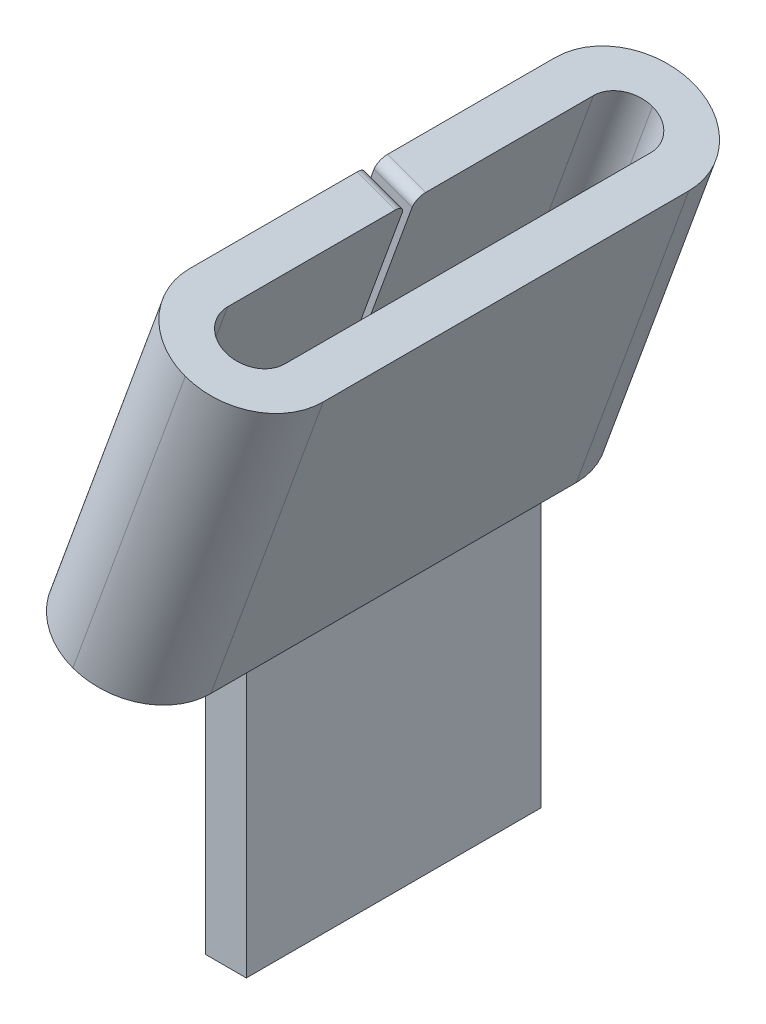
ISO-10303-21;
HEADER;
FILE_DESCRIPTION(('STEP AP214'),'2;1');
FILE_NAME('part.step','',(''),(''),'','','');
FILE_SCHEMA(('AUTOMOTIVE_DESIGN { 1 0 10303 214 1 1 1 1 }'));
ENDSEC;
DATA;
#1=APPLICATION_CONTEXT('core data for automotive mechanical design processes');
#2=APPLICATION_PROTOCOL_DEFINITION('international standard','automotive_design',2000,#1);
#3=PRODUCT_CONTEXT('',#1,'mechanical');
#4=PRODUCT('Part','Part','',(#3));
#5=PRODUCT_RELATED_PRODUCT_CATEGORY('part','',(#4));
#6=PRODUCT_DEFINITION_FORMATION('','',#4);
#7=PRODUCT_DEFINITION_CONTEXT('part definition',#1,'design');
#8=PRODUCT_DEFINITION('design','',#6,#7);
#9=PRODUCT_DEFINITION_SHAPE('','',#8);
#10=(LENGTH_UNIT() NAMED_UNIT(*) SI_UNIT(.MILLI.,.METRE.));
#11=(NAMED_UNIT(*) PLANE_ANGLE_UNIT() SI_UNIT($,.RADIAN.));
#12=(NAMED_UNIT(*) SI_UNIT($,.STERADIAN.) SOLID_ANGLE_UNIT());
#13=UNCERTAINTY_MEASURE_WITH_UNIT(LENGTH_MEASURE(1.E-05),#10,'distance_accuracy_value','');
#14=(GEOMETRIC_REPRESENTATION_CONTEXT(3) GLOBAL_UNCERTAINTY_ASSIGNED_CONTEXT((#13)) GLOBAL_UNIT_ASSIGNED_CONTEXT((#10,
#11,#12)) REPRESENTATION_CONTEXT('',''));
#15=CARTESIAN_POINT('',(0.,0.,0.));
#16=DIRECTION('',(0.,0.,1.));
#17=DIRECTION('',(1.,0.,0.));
#18=AXIS2_PLACEMENT_3D('',#15,#16,#17);
#19=CARTESIAN_POINT('',(18.9404173832291,24.3126452780733,53.877124258992));
#20=DIRECTION('',(-0.939692620785908,0.342020143325669,0.));
#21=DIRECTION('',(0.342020143325669,0.939692620785908,0.));
#22=AXIS2_PLACEMENT_3D('',#19,#20,#21);
#23=CYLINDRICAL_SURFACE('',#22,0.5);
#24=CARTESIAN_POINT('',(16.1213395208714,25.3387057080503,53.877124258992));
#25=DIRECTION('',(0.939692620785908,-0.342020143325669,0.));
#26=DIRECTION('',(-0.342020143325669,-0.939692620785908,0.));
#27=AXIS2_PLACEMENT_3D('',#24,#25,#26);
#28=CIRCLE('',#27,0.5);
#29=CARTESIAN_POINT('',(16.1213395208714,25.3387057080503,54.377124258992));
#30=VERTEX_POINT('',#29);
#31=CARTESIAN_POINT('',(15.9503294492085,24.8688593976573,53.877124258992));
#32=VERTEX_POINT('',#31);
#33=EDGE_CURVE('E282',#30,#32,#28,.T.);
#34=ORIENTED_EDGE('',*,*,#33,.F.);
#35=DIRECTION('',(0.939692620785909,-0.342020143325666,0.));
#36=VECTOR('',#35,1.);
#37=CARTESIAN_POINT('',(17.2959552968538,24.9111805288932,54.377124258992));
#38=LINE('',#37,#36);
#39=CARTESIAN_POINT('',(14.2419542792995,26.0227459947016,54.377124258992));
#40=VERTEX_POINT('',#39);
#41=EDGE_CURVE('E36',#40,#30,#38,.T.);
#42=ORIENTED_EDGE('',*,*,#41,.F.);
#43=CARTESIAN_POINT('',(14.2419542792995,26.0227459947016,53.877124258992));
#44=DIRECTION('',(-0.939692620785909,0.342020143325666,0.));
#45=DIRECTION('',(-0.342020143325666,-0.939692620785909,0.));
#46=AXIS2_PLACEMENT_3D('',#43,#44,#45);
#47=CIRCLE('',#46,0.5);
#48=CARTESIAN_POINT('',(14.0709442076367,25.5528996843087,53.877124258992));
#49=VERTEX_POINT('',#48);
#50=EDGE_CURVE('E377',#49,#40,#47,.T.);
#51=ORIENTED_EDGE('',*,*,#50,.F.);
#52=DIRECTION('',(-0.939692620785909,0.342020143325666,0.));
#53=VECTOR('',#52,1.);
#54=CARTESIAN_POINT('',(18.7694073115662,23.8427989676803,53.877124258992));
#55=LINE('',#54,#53);
#56=EDGE_CURVE('E262',#32,#49,#55,.T.);
#57=ORIENTED_EDGE('',*,*,#56,.F.);
#58=EDGE_LOOP('',(#34,#42,#51,#57));
#59=FACE_BOUND('',#58,.T.);
#60=ADVANCED_FACE('F16',(#59),#23,.T.);
#61=CARTESIAN_POINT('',(18.9404173832291,24.3126452780733,55.377124258992));
#62=DIRECTION('',(0.939692620785908,-0.342020143325669,0.));
#63=DIRECTION('',(-0.342020143325669,-0.939692620785908,0.));
#64=AXIS2_PLACEMENT_3D('',#61,#62,#63);
#65=CYLINDRICAL_SURFACE('',#64,0.5);
#66=CARTESIAN_POINT('',(14.2419542792995,26.0227459947016,55.377124258992));
#67=DIRECTION('',(-0.939692620785909,0.342020143325666,0.));
#68=DIRECTION('',(-0.342020143325666,-0.939692620785909,0.));
#69=AXIS2_PLACEMENT_3D('',#66,#67,#68);
#70=CIRCLE('',#69,0.5);
#71=CARTESIAN_POINT('',(14.2419542792995,26.0227459947016,54.877124258992));
#72=VERTEX_POINT('',#71);
#73=CARTESIAN_POINT('',(14.0709442076367,25.5528996843087,55.377124258992));
#74=VERTEX_POINT('',#73);
#75=EDGE_CURVE('E614',#72,#74,#70,.T.);
#76=ORIENTED_EDGE('',*,*,#75,.F.);
#77=DIRECTION('',(-0.939692620785909,0.342020143325666,0.));
#78=VECTOR('',#77,1.);
#79=CARTESIAN_POINT('',(17.2959552968538,24.9111805288932,54.877124258992));
#80=LINE('',#79,#78);
#81=CARTESIAN_POINT('',(16.1213395208714,25.3387057080503,54.877124258992));
#82=VERTEX_POINT('',#81);
#83=EDGE_CURVE('E11',#82,#72,#80,.T.);
#84=ORIENTED_EDGE('',*,*,#83,.F.);
#85=CARTESIAN_POINT('',(16.1213395208714,25.3387057080503,55.377124258992));
#86=DIRECTION('',(0.939692620785908,-0.342020143325669,0.));
#87=DIRECTION('',(-0.342020143325669,-0.939692620785908,0.));
#88=AXIS2_PLACEMENT_3D('',#85,#86,#87);
#89=CIRCLE('',#88,0.5);
#90=CARTESIAN_POINT('',(15.9503294492085,24.8688593976573,55.377124258992));
#91=VERTEX_POINT('',#90);
#92=EDGE_CURVE('E508',#91,#82,#89,.T.);
#93=ORIENTED_EDGE('',*,*,#92,.F.);
#94=DIRECTION('',(0.939692620785909,-0.342020143325666,0.));
#95=VECTOR('',#94,1.);
#96=CARTESIAN_POINT('',(18.7694073115662,23.8427989676803,55.377124258992));
#97=LINE('',#96,#95);
#98=EDGE_CURVE('E466',#74,#91,#97,.T.);
#99=ORIENTED_EDGE('',*,*,#98,.F.);
#100=EDGE_LOOP('',(#76,#84,#93,#99));
#101=FACE_BOUND('',#100,.T.);
#102=ADVANCED_FACE('F566',(#101),#65,.T.);
#103=CARTESIAN_POINT('',(22.4862827143743,39.1714879081073,55.377124258992));
#104=DIRECTION('',(-0.939692620785909,0.342020143325667,0.));
#105=DIRECTION('',(0.342020143325667,0.939692620785909,0.));
#106=AXIS2_PLACEMENT_3D('',#103,#104,#105);
#107=CYLINDRICAL_SURFACE('',#106,0.5);
#108=CARTESIAN_POINT('',(19.4322816968201,40.2830533739157,55.377124258992));
#109=DIRECTION('',(-0.939692620785909,0.342020143325667,0.));
#110=DIRECTION('',(-0.342020143325667,-0.939692620785909,0.));
#111=AXIS2_PLACEMENT_3D('',#108,#109,#110);
#112=CIRCLE('',#111,0.5);
#113=CARTESIAN_POINT('',(19.6032917684829,40.7528996843086,55.377124258992));
#114=VERTEX_POINT('',#113);
#115=CARTESIAN_POINT('',(19.4322816968201,40.2830533739157,54.877124258992));
#116=VERTEX_POINT('',#115);
#117=EDGE_CURVE('E617',#114,#116,#112,.T.);
#118=ORIENTED_EDGE('',*,*,#117,.F.);
#119=DIRECTION('',(-0.939692620785909,0.342020143325666,0.));
#120=VECTOR('',#119,1.);
#121=CARTESIAN_POINT('',(19.6032917684829,40.7528996843086,55.377124258992));
#122=LINE('',#121,#120);
#123=CARTESIAN_POINT('',(21.4826770100548,40.0688593976573,55.377124258992));
#124=VERTEX_POINT('',#123);
#125=EDGE_CURVE('E353',#124,#114,#122,.T.);
#126=ORIENTED_EDGE('',*,*,#125,.F.);
#127=CARTESIAN_POINT('',(21.3116669383919,39.5990130872643,55.377124258992));
#128=DIRECTION('',(0.939692620785909,-0.342020143325667,0.));
#129=DIRECTION('',(-0.342020143325667,-0.939692620785909,0.));
#130=AXIS2_PLACEMENT_3D('',#127,#128,#129);
#131=CIRCLE('',#130,0.5);
#132=CARTESIAN_POINT('',(21.3116669383919,39.5990130872644,54.877124258992));
#133=VERTEX_POINT('',#132);
#134=EDGE_CURVE('E497',#133,#124,#131,.T.);
#135=ORIENTED_EDGE('',*,*,#134,.F.);
#136=DIRECTION('',(0.939692620785909,-0.342020143325666,0.));
#137=VECTOR('',#136,1.);
#138=CARTESIAN_POINT('',(21.3116669383919,39.5990130872643,54.877124258992));
#139=LINE('',#138,#137);
#140=EDGE_CURVE('E19',#116,#133,#139,.T.);
#141=ORIENTED_EDGE('',*,*,#140,.F.);
#142=EDGE_LOOP('',(#118,#126,#135,#141));
#143=FACE_BOUND('',#142,.T.);
#144=ADVANCED_FACE('F570',(#143),#107,.T.);
#145=CARTESIAN_POINT('',(22.4862827143743,39.1714879081073,53.877124258992));
#146=DIRECTION('',(0.939692620785909,-0.342020143325667,0.));
#147=DIRECTION('',(-0.342020143325667,-0.939692620785909,0.));
#148=AXIS2_PLACEMENT_3D('',#145,#146,#147);
#149=CYLINDRICAL_SURFACE('',#148,0.5);
#150=CARTESIAN_POINT('',(21.3116669383919,39.5990130872643,53.877124258992));
#151=DIRECTION('',(0.939692620785909,-0.342020143325667,0.));
#152=DIRECTION('',(-0.342020143325667,-0.939692620785909,0.));
#153=AXIS2_PLACEMENT_3D('',#150,#151,#152);
#154=CIRCLE('',#153,0.5);
#155=CARTESIAN_POINT('',(21.4826770100548,40.0688593976573,53.877124258992));
#156=VERTEX_POINT('',#155);
#157=CARTESIAN_POINT('',(21.3116669383919,39.5990130872644,54.377124258992));
#158=VERTEX_POINT('',#157);
#159=EDGE_CURVE('E277',#156,#158,#154,.T.);
#160=ORIENTED_EDGE('',*,*,#159,.F.);
#161=DIRECTION('',(0.939692620785909,-0.342020143325666,0.));
#162=VECTOR('',#161,1.);
#163=CARTESIAN_POINT('',(21.4826770100547,40.0688593976573,53.877124258992));
#164=LINE('',#163,#162);
#165=CARTESIAN_POINT('',(19.6032917684829,40.7528996843086,53.877124258992));
#166=VERTEX_POINT('',#165);
#167=EDGE_CURVE('E329',#166,#156,#164,.T.);
#168=ORIENTED_EDGE('',*,*,#167,.F.);
#169=CARTESIAN_POINT('',(19.4322816968201,40.2830533739157,53.877124258992));
#170=DIRECTION('',(-0.939692620785909,0.342020143325667,0.));
#171=DIRECTION('',(-0.342020143325667,-0.939692620785909,0.));
#172=AXIS2_PLACEMENT_3D('',#169,#170,#171);
#173=CIRCLE('',#172,0.5);
#174=CARTESIAN_POINT('',(19.4322816968201,40.2830533739157,54.377124258992));
#175=VERTEX_POINT('',#174);
#176=EDGE_CURVE('E371',#175,#166,#173,.T.);
#177=ORIENTED_EDGE('',*,*,#176,.F.);
#178=DIRECTION('',(-0.939692620785909,0.342020143325666,0.));
#179=VECTOR('',#178,1.);
#180=CARTESIAN_POINT('',(19.4322816968201,40.2830533739157,54.377124258992));
#181=LINE('',#180,#179);
#182=EDGE_CURVE('E49',#158,#175,#181,.T.);
#183=ORIENTED_EDGE('',*,*,#182,.F.);
#184=EDGE_LOOP('',(#160,#168,#177,#183));
#185=FACE_BOUND('',#184,.T.);
#186=ADVANCED_FACE('F575',(#185),#149,.T.);
#187=CARTESIAN_POINT('',(10.5169970674895,6.28614586628859,54.877124258992));
#188=DIRECTION('',(0.,0.,1.));
#189=DIRECTION('',(0.,-1.,0.));
#190=AXIS2_PLACEMENT_3D('',#187,#188,#189);
#191=PLANE('',#190);
#192=DIRECTION('',(0.342020143325666,0.939692620785909,0.));
#193=VECTOR('',#192,1.);
#194=CARTESIAN_POINT('',(7.46299604993528,7.39771133209699,54.877124258992));
#195=LINE('',#194,#193);
#196=EDGE_CURVE('E619',#72,#116,#195,.T.);
#197=ORIENTED_EDGE('',*,*,#196,.T.);
#198=ORIENTED_EDGE('',*,*,#140,.T.);
#199=DIRECTION('',(0.342020143325666,0.939692620785909,0.));
#200=VECTOR('',#199,1.);
#201=CARTESIAN_POINT('',(12.1626281044303,14.4622354812413,54.877124258992));
#202=LINE('',#201,#200);
#203=EDGE_CURVE('E493',#82,#133,#202,.T.);
#204=ORIENTED_EDGE('',*,*,#203,.F.);
#205=ORIENTED_EDGE('',*,*,#83,.T.);
#206=EDGE_LOOP('',(#197,#198,#204,#205));
#207=FACE_BOUND('',#206,.T.);
#208=ADVANCED_FACE('F580',(#207),#191,.F.);
#209=CARTESIAN_POINT('',(10.5169970674895,6.28614586628859,54.377124258992));
#210=DIRECTION('',(0.,0.,-1.));
#211=DIRECTION('',(0.,-1.,0.));
#212=AXIS2_PLACEMENT_3D('',#209,#210,#211);
#213=PLANE('',#212);
#214=DIRECTION('',(-0.342020143325666,-0.939692620785909,0.));
#215=VECTOR('',#214,1.);
#216=CARTESIAN_POINT('',(12.1626281044303,14.4622354812413,54.377124258992));
#217=LINE('',#216,#215);
#218=EDGE_CURVE('E281',#158,#30,#217,.T.);
#219=ORIENTED_EDGE('',*,*,#218,.F.);
#220=ORIENTED_EDGE('',*,*,#182,.T.);
#221=DIRECTION('',(-0.342020143325666,-0.939692620785909,0.));
#222=VECTOR('',#221,1.);
#223=CARTESIAN_POINT('',(7.46299604993528,7.39771133209699,54.377124258992));
#224=LINE('',#223,#222);
#225=EDGE_CURVE('E368',#175,#40,#224,.T.);
#226=ORIENTED_EDGE('',*,*,#225,.T.);
#227=ORIENTED_EDGE('',*,*,#41,.T.);
#228=EDGE_LOOP('',(#219,#220,#226,#227));
#229=FACE_BOUND('',#228,.T.);
#230=ADVANCED_FACE('F583',(#229),#213,.F.);
#231=CARTESIAN_POINT('',(17.3598683803874,24.3558291826688,45.627124258992));
#232=DIRECTION('',(-0.342020143325665,-0.93969262078591,0.));
#233=DIRECTION('',(-0.93969262078591,0.342020143325665,0.));
#234=AXIS2_PLACEMENT_3D('',#231,#232,#233);
#235=CYLINDRICAL_SURFACE('',#234,3.5);
#236=CARTESIAN_POINT('',(17.3598683803874,24.3558291826688,45.627124258992));
#237=DIRECTION('',(-0.342020143325666,-0.939692620785909,0.));
#238=DIRECTION('',(-0.939692620785909,0.342020143325666,0.));
#239=AXIS2_PLACEMENT_3D('',#236,#237,#238);
#240=CIRCLE('',#239,3.5);
#241=CARTESIAN_POINT('',(17.3598683803874,24.3558291826688,42.1271242589921));
#242=VERTEX_POINT('',#241);
#243=CARTESIAN_POINT('',(20.6487925531381,23.158758681029,45.627124258992));
#244=VERTEX_POINT('',#243);
#245=EDGE_CURVE('E246',#242,#244,#240,.T.);
#246=ORIENTED_EDGE('',*,*,#245,.F.);
#247=DIRECTION('',(0.342020143325666,0.939692620785909,0.));
#248=VECTOR('',#247,1.);
#249=CARTESIAN_POINT('',(17.3598683803874,24.3558291826688,42.1271242589921));
#250=LINE('',#249,#248);
#251=CARTESIAN_POINT('',(22.8922159412336,39.5558291826688,42.1271242589921));
#252=VERTEX_POINT('',#251);
#253=EDGE_CURVE('E233',#242,#252,#250,.T.);
#254=ORIENTED_EDGE('',*,*,#253,.T.);
#255=CARTESIAN_POINT('',(22.8922159412336,39.5558291826688,45.627124258992));
#256=DIRECTION('',(0.342020143325667,0.939692620785909,0.));
#257=DIRECTION('',(-0.939692620785909,0.342020143325667,0.));
#258=AXIS2_PLACEMENT_3D('',#255,#256,#257);
#259=CIRCLE('',#258,3.5);
#260=CARTESIAN_POINT('',(26.1811401139843,38.358758681029,45.627124258992));
#261=VERTEX_POINT('',#260);
#262=EDGE_CURVE('E363',#261,#252,#259,.T.);
#263=ORIENTED_EDGE('',*,*,#262,.F.);
#264=DIRECTION('',(0.342020143325665,0.93969262078591,0.));
#265=VECTOR('',#264,1.);
#266=CARTESIAN_POINT('',(26.1811401139843,38.358758681029,45.627124258992));
#267=LINE('',#266,#265);
#268=EDGE_CURVE('E249',#244,#261,#267,.T.);
#269=ORIENTED_EDGE('',*,*,#268,.F.);
#270=EDGE_LOOP('',(#246,#254,#263,#269));
#271=FACE_BOUND('',#270,.T.);
#272=ADVANCED_FACE('F247',(#271),#235,.T.);
#273=CARTESIAN_POINT('',(17.3598683803874,24.3558291826688,45.627124258992));
#274=DIRECTION('',(0.342020143325666,0.939692620785909,0.));
#275=DIRECTION('',(0.939692620785909,-0.342020143325666,0.));
#276=AXIS2_PLACEMENT_3D('',#273,#274,#275);
#277=CYLINDRICAL_SURFACE('',#276,3.5);
#278=ORIENTED_EDGE('',*,*,#253,.F.);
#279=CARTESIAN_POINT('',(17.3598683803874,24.3558291826688,45.627124258992));
#280=DIRECTION('',(-0.342020143325666,-0.939692620785909,0.));
#281=DIRECTION('',(-0.939692620785909,0.342020143325666,0.));
#282=AXIS2_PLACEMENT_3D('',#279,#280,#281);
#283=CIRCLE('',#282,3.5);
#284=CARTESIAN_POINT('',(14.0709442076367,25.5528996843087,45.627124258992));
#285=VERTEX_POINT('',#284);
#286=EDGE_CURVE('E237',#285,#242,#283,.T.);
#287=ORIENTED_EDGE('',*,*,#286,.F.);
#288=DIRECTION('',(-0.342020143325666,-0.939692620785909,0.));
#289=VECTOR('',#288,1.);
#290=CARTESIAN_POINT('',(14.0709442076367,25.5528996843087,45.627124258992));
#291=LINE('',#290,#289);
#292=CARTESIAN_POINT('',(19.6032917684829,40.7528996843086,45.627124258992));
#293=VERTEX_POINT('',#292);
#294=EDGE_CURVE('E374',#293,#285,#291,.T.);
#295=ORIENTED_EDGE('',*,*,#294,.F.);
#296=CARTESIAN_POINT('',(22.8922159412336,39.5558291826688,45.627124258992));
#297=DIRECTION('',(0.342020143325667,0.939692620785909,0.));
#298=DIRECTION('',(-0.939692620785909,0.342020143325667,0.));
#299=AXIS2_PLACEMENT_3D('',#296,#297,#298);
#300=CIRCLE('',#299,3.5);
#301=EDGE_CURVE('E240',#252,#293,#300,.T.);
#302=ORIENTED_EDGE('',*,*,#301,.F.);
#303=EDGE_LOOP('',(#278,#287,#295,#302));
#304=FACE_BOUND('',#303,.T.);
#305=ADVANCED_FACE('F235',(#304),#277,.T.);
#306=CARTESIAN_POINT('',(17.3598683803874,24.3558291826688,63.627124258992));
#307=DIRECTION('',(-0.342020143325666,-0.939692620785909,0.));
#308=DIRECTION('',(-0.939692620785909,0.342020143325666,0.));
#309=AXIS2_PLACEMENT_3D('',#306,#307,#308);
#310=CYLINDRICAL_SURFACE('',#309,3.5);
#311=CARTESIAN_POINT('',(17.3598683803874,24.3558291826688,63.627124258992));
#312=DIRECTION('',(-0.342020143325666,-0.939692620785909,0.));
#313=DIRECTION('',(-0.939692620785909,0.342020143325666,0.));
#314=AXIS2_PLACEMENT_3D('',#311,#312,#313);
#315=CIRCLE('',#314,3.5);
#316=CARTESIAN_POINT('',(17.3598683803874,24.3558291826688,67.127124258992));
#317=VERTEX_POINT('',#316);
#318=CARTESIAN_POINT('',(14.0709442076367,25.5528996843087,63.627124258992));
#319=VERTEX_POINT('',#318);
#320=EDGE_CURVE('E459',#317,#319,#315,.T.);
#321=ORIENTED_EDGE('',*,*,#320,.F.);
#322=DIRECTION('',(0.342020143325665,0.93969262078591,0.));
#323=VECTOR('',#322,1.);
#324=CARTESIAN_POINT('',(17.3598683803874,24.3558291826688,67.127124258992));
#325=LINE('',#324,#323);
#326=CARTESIAN_POINT('',(22.8922159412336,39.5558291826688,67.127124258992));
#327=VERTEX_POINT('',#326);
#328=EDGE_CURVE('E244',#317,#327,#325,.T.);
#329=ORIENTED_EDGE('',*,*,#328,.T.);
#330=CARTESIAN_POINT('',(22.8922159412336,39.5558291826688,63.627124258992));
#331=DIRECTION('',(0.342020143325667,0.939692620785909,0.));
#332=DIRECTION('',(-0.939692620785909,0.342020143325667,0.));
#333=AXIS2_PLACEMENT_3D('',#330,#331,#332);
#334=CIRCLE('',#333,3.5);
#335=CARTESIAN_POINT('',(19.6032917684829,40.7528996843086,63.627124258992));
#336=VERTEX_POINT('',#335);
#337=EDGE_CURVE('E356',#336,#327,#334,.T.);
#338=ORIENTED_EDGE('',*,*,#337,.F.);
#339=DIRECTION('',(0.342020143325666,0.939692620785909,0.));
#340=VECTOR('',#339,1.);
#341=CARTESIAN_POINT('',(19.6032917684829,40.7528996843086,63.627124258992));
#342=LINE('',#341,#340);
#343=EDGE_CURVE('E471',#319,#336,#342,.T.);
#344=ORIENTED_EDGE('',*,*,#343,.F.);
#345=EDGE_LOOP('',(#321,#329,#338,#344));
#346=FACE_BOUND('',#345,.T.);
#347=ADVANCED_FACE('F562',(#346),#310,.T.);
#348=CARTESIAN_POINT('',(17.3598683803874,24.3558291826688,63.627124258992));
#349=DIRECTION('',(0.342020143325665,0.93969262078591,0.));
#350=DIRECTION('',(0.93969262078591,-0.342020143325665,0.));
#351=AXIS2_PLACEMENT_3D('',#348,#349,#350);
#352=CYLINDRICAL_SURFACE('',#351,3.5);
#353=ORIENTED_EDGE('',*,*,#328,.F.);
#354=CARTESIAN_POINT('',(17.3598683803874,24.3558291826688,63.627124258992));
#355=DIRECTION('',(-0.342020143325666,-0.939692620785909,0.));
#356=DIRECTION('',(-0.939692620785909,0.342020143325666,0.));
#357=AXIS2_PLACEMENT_3D('',#354,#355,#356);
#358=CIRCLE('',#357,3.5);
#359=CARTESIAN_POINT('',(20.6487925531381,23.158758681029,63.627124258992));
#360=VERTEX_POINT('',#359);
#361=EDGE_CURVE('E483',#360,#317,#358,.T.);
#362=ORIENTED_EDGE('',*,*,#361,.F.);
#363=DIRECTION('',(-0.342020143325665,-0.93969262078591,0.));
#364=VECTOR('',#363,1.);
#365=CARTESIAN_POINT('',(20.6487925531381,23.158758681029,63.627124258992));
#366=LINE('',#365,#364);
#367=CARTESIAN_POINT('',(26.1811401139843,38.358758681029,63.627124258992));
#368=VERTEX_POINT('',#367);
#369=EDGE_CURVE('E317',#368,#360,#366,.T.);
#370=ORIENTED_EDGE('',*,*,#369,.F.);
#371=CARTESIAN_POINT('',(22.8922159412336,39.5558291826688,63.627124258992));
#372=DIRECTION('',(0.342020143325667,0.939692620785909,0.));
#373=DIRECTION('',(-0.939692620785909,0.342020143325667,0.));
#374=AXIS2_PLACEMENT_3D('',#371,#372,#373);
#375=CIRCLE('',#374,3.5);
#376=EDGE_CURVE('E360',#327,#368,#375,.T.);
#377=ORIENTED_EDGE('',*,*,#376,.F.);
#378=EDGE_LOOP('',(#353,#362,#370,#377));
#379=FACE_BOUND('',#378,.T.);
#380=ADVANCED_FACE('F554',(#379),#352,.T.);
#381=CARTESIAN_POINT('',(13.5721670356092,13.9492052662528,45.627124258992));
#382=DIRECTION('',(-0.342020143325667,-0.939692620785909,0.));
#383=DIRECTION('',(-0.939692620785909,0.342020143325667,0.));
#384=AXIS2_PLACEMENT_3D('',#381,#382,#383);
#385=CYLINDRICAL_SURFACE('',#384,1.5);
#386=CARTESIAN_POINT('',(17.3598683803874,24.3558291826688,45.627124258992));
#387=DIRECTION('',(0.342020143325666,0.939692620785909,0.));
#388=DIRECTION('',(-0.939692620785909,0.342020143325666,0.));
#389=AXIS2_PLACEMENT_3D('',#386,#387,#388);
#390=CIRCLE('',#389,1.5);
#391=CARTESIAN_POINT('',(17.3598683803874,24.3558291826688,44.127124258992));
#392=VERTEX_POINT('',#391);
#393=CARTESIAN_POINT('',(15.9503294492085,24.8688593976573,45.627124258992));
#394=VERTEX_POINT('',#393);
#395=EDGE_CURVE('E276',#392,#394,#390,.T.);
#396=ORIENTED_EDGE('',*,*,#395,.F.);
#397=DIRECTION('',(0.342020143325668,0.939692620785909,0.));
#398=VECTOR('',#397,1.);
#399=CARTESIAN_POINT('',(22.8922159412336,39.5558291826688,44.127124258992));
#400=LINE('',#399,#398);
#401=CARTESIAN_POINT('',(22.8922159412336,39.5558291826688,44.127124258992));
#402=VERTEX_POINT('',#401);
#403=EDGE_CURVE('E291',#392,#402,#400,.T.);
#404=ORIENTED_EDGE('',*,*,#403,.T.);
#405=CARTESIAN_POINT('',(22.8922159412336,39.5558291826688,45.627124258992));
#406=DIRECTION('',(-0.342020143325664,-0.93969262078591,0.));
#407=DIRECTION('',(-0.93969262078591,0.342020143325664,0.));
#408=AXIS2_PLACEMENT_3D('',#405,#406,#407);
#409=CIRCLE('',#408,1.5);
#410=CARTESIAN_POINT('',(21.4826770100548,40.0688593976573,45.627124258992));
#411=VERTEX_POINT('',#410);
#412=EDGE_CURVE('E337',#411,#402,#409,.T.);
#413=ORIENTED_EDGE('',*,*,#412,.F.);
#414=DIRECTION('',(0.342020143325666,0.939692620785909,0.));
#415=VECTOR('',#414,1.);
#416=CARTESIAN_POINT('',(21.4826770100548,40.0688593976573,45.627124258992));
#417=LINE('',#416,#415);
#418=EDGE_CURVE('E285',#394,#411,#417,.T.);
#419=ORIENTED_EDGE('',*,*,#418,.F.);
#420=EDGE_LOOP('',(#396,#404,#413,#419));
#421=FACE_BOUND('',#420,.T.);
#422=ADVANCED_FACE('F552',(#421),#385,.F.);
#423=CARTESIAN_POINT('',(13.5721670356092,13.9492052662528,45.627124258992));
#424=DIRECTION('',(-0.342020143325668,-0.939692620785909,0.));
#425=DIRECTION('',(-0.939692620785909,0.342020143325668,0.));
#426=AXIS2_PLACEMENT_3D('',#423,#424,#425);
#427=CYLINDRICAL_SURFACE('',#426,1.5);
#428=ORIENTED_EDGE('',*,*,#403,.F.);
#429=CARTESIAN_POINT('',(17.3598683803874,24.3558291826688,45.627124258992));
#430=DIRECTION('',(0.342020143325666,0.939692620785909,0.));
#431=DIRECTION('',(-0.939692620785909,0.342020143325666,0.));
#432=AXIS2_PLACEMENT_3D('',#429,#430,#431);
#433=CIRCLE('',#432,1.5);
#434=CARTESIAN_POINT('',(18.7694073115663,23.8427989676803,45.627124258992));
#435=VERTEX_POINT('',#434);
#436=EDGE_CURVE('E272',#435,#392,#433,.T.);
#437=ORIENTED_EDGE('',*,*,#436,.F.);
#438=DIRECTION('',(-0.342020143325668,-0.939692620785909,0.));
#439=VECTOR('',#438,1.);
#440=CARTESIAN_POINT('',(18.7694073115662,23.8427989676803,45.627124258992));
#441=LINE('',#440,#439);
#442=CARTESIAN_POINT('',(24.3017548724125,39.0427989676803,45.627124258992));
#443=VERTEX_POINT('',#442);
#444=EDGE_CURVE('E423',#443,#435,#441,.T.);
#445=ORIENTED_EDGE('',*,*,#444,.F.);
#446=CARTESIAN_POINT('',(22.8922159412336,39.5558291826688,45.627124258992));
#447=DIRECTION('',(-0.342020143325664,-0.93969262078591,0.));
#448=DIRECTION('',(-0.93969262078591,0.342020143325664,0.));
#449=AXIS2_PLACEMENT_3D('',#446,#447,#448);
#450=CIRCLE('',#449,1.5);
#451=EDGE_CURVE('E343',#402,#443,#450,.T.);
#452=ORIENTED_EDGE('',*,*,#451,.F.);
#453=EDGE_LOOP('',(#428,#437,#445,#452));
#454=FACE_BOUND('',#453,.T.);
#455=ADVANCED_FACE('F443',(#454),#427,.F.);
#456=CARTESIAN_POINT('',(17.3598683803874,24.3558291826688,63.627124258992));
#457=DIRECTION('',(-0.342020143325666,-0.939692620785909,0.));
#458=DIRECTION('',(-0.939692620785909,0.342020143325666,0.));
#459=AXIS2_PLACEMENT_3D('',#456,#457,#458);
#460=CYLINDRICAL_SURFACE('',#459,1.5);
#461=CARTESIAN_POINT('',(17.3598683803874,24.3558291826688,63.627124258992));
#462=DIRECTION('',(0.342020143325666,0.939692620785909,0.));
#463=DIRECTION('',(-0.939692620785909,0.342020143325666,0.));
#464=AXIS2_PLACEMENT_3D('',#461,#462,#463);
#465=CIRCLE('',#464,1.5);
#466=CARTESIAN_POINT('',(17.3598683803874,24.3558291826688,65.127124258992));
#467=VERTEX_POINT('',#466);
#468=CARTESIAN_POINT('',(18.7694073115663,23.8427989676803,63.627124258992));
#469=VERTEX_POINT('',#468);
#470=EDGE_CURVE('E465',#467,#469,#465,.T.);
#471=ORIENTED_EDGE('',*,*,#470,.F.);
#472=DIRECTION('',(0.342020143325666,0.939692620785909,0.));
#473=VECTOR('',#472,1.);
#474=CARTESIAN_POINT('',(22.8922159412336,39.5558291826688,65.127124258992));
#475=LINE('',#474,#473);
#476=CARTESIAN_POINT('',(22.8922159412336,39.5558291826688,65.127124258992));
#477=VERTEX_POINT('',#476);
#478=EDGE_CURVE('E288',#467,#477,#475,.T.);
#479=ORIENTED_EDGE('',*,*,#478,.T.);
#480=CARTESIAN_POINT('',(22.8922159412336,39.5558291826688,63.627124258992));
#481=DIRECTION('',(-0.342020143325664,-0.93969262078591,0.));
#482=DIRECTION('',(-0.93969262078591,0.342020143325664,0.));
#483=AXIS2_PLACEMENT_3D('',#480,#481,#482);
#484=CIRCLE('',#483,1.5);
#485=CARTESIAN_POINT('',(24.3017548724125,39.0427989676803,63.627124258992));
#486=VERTEX_POINT('',#485);
#487=EDGE_CURVE('E346',#486,#477,#484,.T.);
#488=ORIENTED_EDGE('',*,*,#487,.F.);
#489=DIRECTION('',(0.342020143325668,0.939692620785909,0.));
#490=VECTOR('',#489,1.);
#491=CARTESIAN_POINT('',(24.3017548724125,39.0427989676803,63.627124258992));
#492=LINE('',#491,#490);
#493=EDGE_CURVE('E415',#469,#486,#492,.T.);
#494=ORIENTED_EDGE('',*,*,#493,.F.);
#495=EDGE_LOOP('',(#471,#479,#488,#494));
#496=FACE_BOUND('',#495,.T.);
#497=ADVANCED_FACE('F546',(#496),#460,.F.);
#498=CARTESIAN_POINT('',(13.5721670356092,13.9492052662528,63.627124258992));
#499=DIRECTION('',(-0.342020143325667,-0.939692620785909,0.));
#500=DIRECTION('',(-0.939692620785909,0.342020143325667,0.));
#501=AXIS2_PLACEMENT_3D('',#498,#499,#500);
#502=CYLINDRICAL_SURFACE('',#501,1.5);
#503=ORIENTED_EDGE('',*,*,#478,.F.);
#504=CARTESIAN_POINT('',(17.3598683803874,24.3558291826688,63.627124258992));
#505=DIRECTION('',(0.342020143325666,0.939692620785909,0.));
#506=DIRECTION('',(-0.939692620785909,0.342020143325666,0.));
#507=AXIS2_PLACEMENT_3D('',#504,#505,#506);
#508=CIRCLE('',#507,1.5);
#509=CARTESIAN_POINT('',(15.9503294492085,24.8688593976573,63.627124258992));
#510=VERTEX_POINT('',#509);
#511=EDGE_CURVE('E478',#510,#467,#508,.T.);
#512=ORIENTED_EDGE('',*,*,#511,.F.);
#513=DIRECTION('',(-0.342020143325666,-0.939692620785909,0.));
#514=VECTOR('',#513,1.);
#515=CARTESIAN_POINT('',(15.9503294492085,24.8688593976573,63.627124258992));
#516=LINE('',#515,#514);
#517=CARTESIAN_POINT('',(21.4826770100548,40.0688593976573,63.627124258992));
#518=VERTEX_POINT('',#517);
#519=EDGE_CURVE('E505',#518,#510,#516,.T.);
#520=ORIENTED_EDGE('',*,*,#519,.F.);
#521=CARTESIAN_POINT('',(22.8922159412336,39.5558291826688,63.627124258992));
#522=DIRECTION('',(-0.342020143325664,-0.93969262078591,0.));
#523=DIRECTION('',(-0.93969262078591,0.342020143325664,0.));
#524=AXIS2_PLACEMENT_3D('',#521,#522,#523);
#525=CIRCLE('',#524,1.5);
#526=EDGE_CURVE('E350',#477,#518,#525,.T.);
#527=ORIENTED_EDGE('',*,*,#526,.F.);
#528=EDGE_LOOP('',(#503,#512,#520,#527));
#529=FACE_BOUND('',#528,.T.);
#530=ADVANCED_FACE('F638',(#529),#502,.F.);
#531=CARTESIAN_POINT('',(12.1626281044303,14.4622354812413,54.627124258992));
#532=DIRECTION('',(-0.939692620785909,0.342020143325666,0.));
#533=DIRECTION('',(0.,0.,1.));
#534=AXIS2_PLACEMENT_3D('',#531,#532,#533);
#535=PLANE('',#534);
#536=DIRECTION('',(0.,0.,1.));
#537=VECTOR('',#536,1.);
#538=CARTESIAN_POINT('',(21.4826770100548,40.0688593976573,54.627124258992));
#539=LINE('',#538,#537);
#540=EDGE_CURVE('E333',#411,#156,#539,.T.);
#541=ORIENTED_EDGE('',*,*,#540,.T.);
#542=ORIENTED_EDGE('',*,*,#159,.T.);
#543=ORIENTED_EDGE('',*,*,#218,.T.);
#544=ORIENTED_EDGE('',*,*,#33,.T.);
#545=DIRECTION('',(0.,0.,1.));
#546=VECTOR('',#545,1.);
#547=CARTESIAN_POINT('',(15.9503294492085,24.8688593976573,28.1271242589921));
#548=LINE('',#547,#546);
#549=EDGE_CURVE('E267',#394,#32,#548,.T.);
#550=ORIENTED_EDGE('',*,*,#549,.F.);
#551=ORIENTED_EDGE('',*,*,#418,.T.);
#552=EDGE_LOOP('',(#541,#542,#543,#544,#550,#551));
#553=FACE_BOUND('',#552,.T.);
#554=ADVANCED_FACE('F446',(#553),#535,.F.);
#555=CARTESIAN_POINT('',(20.6487925531381,23.158758681029,47.377124258992));
#556=DIRECTION('',(0.,0.,1.));
#557=DIRECTION('',(1.,0.,0.));
#558=AXIS2_PLACEMENT_3D('',#555,#556,#557);
#559=PLANE('',#558);
#560=DIRECTION('',(0.342020143325668,0.939692620785909,0.));
#561=VECTOR('',#560,1.);
#562=CARTESIAN_POINT('',(18.7694073115662,23.8427989676803,47.377124258992));
#563=LINE('',#562,#561);
#564=CARTESIAN_POINT('',(18.6487925531381,23.511412642446,47.377124258992));
#565=VERTEX_POINT('',#564);
#566=CARTESIAN_POINT('',(18.7694073115663,23.8427989676803,47.377124258992));
#567=VERTEX_POINT('',#566);
#568=EDGE_CURVE('E309',#565,#567,#563,.T.);
#569=ORIENTED_EDGE('',*,*,#568,.T.);
#570=DIRECTION('',(0.939692620785909,-0.342020143325667,0.));
#571=VECTOR('',#570,1.);
#572=CARTESIAN_POINT('',(18.7694073115662,23.8427989676803,47.377124258992));
#573=LINE('',#572,#571);
#574=CARTESIAN_POINT('',(20.6487925531381,23.158758681029,47.377124258992));
#575=VERTEX_POINT('',#574);
#576=EDGE_CURVE('E254',#567,#575,#573,.T.);
#577=ORIENTED_EDGE('',*,*,#576,.T.);
#578=DIRECTION('',(0.,-1.,0.));
#579=VECTOR('',#578,1.);
#580=CARTESIAN_POINT('',(20.6487925531381,8.15875868102899,47.377124258992));
#581=LINE('',#580,#579);
#582=CARTESIAN_POINT('',(20.6487925531381,10.158758681029,47.377124258992));
#583=VERTEX_POINT('',#582);
#584=EDGE_CURVE('E392',#575,#583,#581,.T.);
#585=ORIENTED_EDGE('',*,*,#584,.T.);
#586=DIRECTION('',(-1.,0.,0.));
#587=VECTOR('',#586,1.);
#588=CARTESIAN_POINT('',(20.6487925531381,10.158758681029,47.377124258992));
#589=LINE('',#588,#587);
#590=CARTESIAN_POINT('',(18.6487925531381,10.158758681029,47.377124258992));
#591=VERTEX_POINT('',#590);
#592=EDGE_CURVE('E512',#583,#591,#589,.T.);
#593=ORIENTED_EDGE('',*,*,#592,.T.);
#594=DIRECTION('',(0.,1.,0.));
#595=VECTOR('',#594,1.);
#596=CARTESIAN_POINT('',(18.6487925531381,23.511412642446,47.377124258992));
#597=LINE('',#596,#595);
#598=EDGE_CURVE('E407',#591,#565,#597,.T.);
#599=ORIENTED_EDGE('',*,*,#598,.T.);
#600=EDGE_LOOP('',(#569,#577,#585,#593,#599));
#601=FACE_BOUND('',#600,.T.);
#602=ADVANCED_FACE('F434',(#601),#559,.F.);
#603=CARTESIAN_POINT('',(20.6487925531381,23.158758681029,61.8771242589921));
#604=DIRECTION('',(0.,0.,1.));
#605=DIRECTION('',(1.,0.,0.));
#606=AXIS2_PLACEMENT_3D('',#603,#604,#605);
#607=PLANE('',#606);
#608=DIRECTION('',(-0.939692620785909,0.342020143325667,0.));
#609=VECTOR('',#608,1.);
#610=CARTESIAN_POINT('',(18.7694073115662,23.8427989676803,61.8771242589921));
#611=LINE('',#610,#609);
#612=CARTESIAN_POINT('',(20.6487925531381,23.158758681029,61.8771242589921));
#613=VERTEX_POINT('',#612);
#614=CARTESIAN_POINT('',(18.7694073115663,23.8427989676803,61.8771242589921));
#615=VERTEX_POINT('',#614);
#616=EDGE_CURVE('E464',#613,#615,#611,.T.);
#617=ORIENTED_EDGE('',*,*,#616,.T.);
#618=DIRECTION('',(-0.342020143325668,-0.939692620785909,0.));
#619=VECTOR('',#618,1.);
#620=CARTESIAN_POINT('',(18.6487925531381,23.511412642446,61.8771242589921));
#621=LINE('',#620,#619);
#622=CARTESIAN_POINT('',(18.6487925531381,23.511412642446,61.8771242589921));
#623=VERTEX_POINT('',#622);
#624=EDGE_CURVE('E311',#615,#623,#621,.T.);
#625=ORIENTED_EDGE('',*,*,#624,.T.);
#626=DIRECTION('',(0.,-1.,0.));
#627=VECTOR('',#626,1.);
#628=CARTESIAN_POINT('',(18.6487925531381,8.15875868102899,61.8771242589921));
#629=LINE('',#628,#627);
#630=CARTESIAN_POINT('',(18.6487925531381,10.158758681029,61.8771242589921));
#631=VERTEX_POINT('',#630);
#632=EDGE_CURVE('E412',#623,#631,#629,.T.);
#633=ORIENTED_EDGE('',*,*,#632,.T.);
#634=DIRECTION('',(1.,0.,0.));
#635=VECTOR('',#634,1.);
#636=CARTESIAN_POINT('',(20.6487925531381,10.158758681029,61.8771242589921));
#637=LINE('',#636,#635);
#638=CARTESIAN_POINT('',(20.6487925531381,10.158758681029,61.8771242589921));
#639=VERTEX_POINT('',#638);
#640=EDGE_CURVE('E518',#631,#639,#637,.T.);
#641=ORIENTED_EDGE('',*,*,#640,.T.);
#642=DIRECTION('',(0.,1.,0.));
#643=VECTOR('',#642,1.);
#644=CARTESIAN_POINT('',(20.6487925531381,23.158758681029,61.8771242589921));
#645=LINE('',#644,#643);
#646=EDGE_CURVE('E398',#639,#613,#645,.T.);
#647=ORIENTED_EDGE('',*,*,#646,.T.);
#648=EDGE_LOOP('',(#617,#625,#633,#641,#647));
#649=FACE_BOUND('',#648,.T.);
#650=ADVANCED_FACE('F538',(#649),#607,.T.);
#651=CARTESIAN_POINT('',(18.7694073115662,23.8427989676803,28.1271242589921));
#652=DIRECTION('',(0.342020143325666,0.939692620785909,0.));
#653=DIRECTION('',(0.,0.,-1.));
#654=AXIS2_PLACEMENT_3D('',#651,#652,#653);
#655=PLANE('',#654);
#656=ORIENTED_EDGE('',*,*,#549,.T.);
#657=ORIENTED_EDGE('',*,*,#56,.T.);
#658=DIRECTION('',(0.,0.,1.));
#659=VECTOR('',#658,1.);
#660=CARTESIAN_POINT('',(14.0709442076367,25.5528996843087,28.1271242589921));
#661=LINE('',#660,#659);
#662=EDGE_CURVE('E259',#285,#49,#661,.T.);
#663=ORIENTED_EDGE('',*,*,#662,.F.);
#664=ORIENTED_EDGE('',*,*,#286,.T.);
#665=ORIENTED_EDGE('',*,*,#245,.T.);
#666=DIRECTION('',(0.,0.,-1.));
#667=VECTOR('',#666,1.);
#668=CARTESIAN_POINT('',(20.6487925531381,23.158758681029,47.377124258992));
#669=LINE('',#668,#667);
#670=EDGE_CURVE('E320',#575,#244,#669,.T.);
#671=ORIENTED_EDGE('',*,*,#670,.F.);
#672=ORIENTED_EDGE('',*,*,#576,.F.);
#673=DIRECTION('',(0.,0.,-1.));
#674=VECTOR('',#673,1.);
#675=CARTESIAN_POINT('',(18.7694073115663,23.8427989676803,28.1271242589921));
#676=LINE('',#675,#674);
#677=EDGE_CURVE('E426',#567,#435,#676,.T.);
#678=ORIENTED_EDGE('',*,*,#677,.T.);
#679=ORIENTED_EDGE('',*,*,#436,.T.);
#680=ORIENTED_EDGE('',*,*,#395,.T.);
#681=EDGE_LOOP('',(#656,#657,#663,#664,#665,#671,#672,#678,#679,#680));
#682=FACE_BOUND('',#681,.T.);
#683=ADVANCED_FACE('F257',(#682),#655,.F.);
#684=CARTESIAN_POINT('',(14.0709442076367,25.5528996843087,67.127124258992));
#685=DIRECTION('',(-0.939692620785909,0.342020143325666,0.));
#686=DIRECTION('',(0.,0.,1.));
#687=AXIS2_PLACEMENT_3D('',#684,#685,#686);
#688=PLANE('',#687);
#689=ORIENTED_EDGE('',*,*,#225,.F.);
#690=ORIENTED_EDGE('',*,*,#176,.T.);
#691=DIRECTION('',(0.,0.,-1.));
#692=VECTOR('',#691,1.);
#693=CARTESIAN_POINT('',(19.6032917684829,40.7528996843086,67.127124258992));
#694=LINE('',#693,#692);
#695=EDGE_CURVE('E325',#166,#293,#694,.T.);
#696=ORIENTED_EDGE('',*,*,#695,.T.);
#697=ORIENTED_EDGE('',*,*,#294,.T.);
#698=ORIENTED_EDGE('',*,*,#662,.T.);
#699=ORIENTED_EDGE('',*,*,#50,.T.);
#700=EDGE_LOOP('',(#689,#690,#696,#697,#698,#699));
#701=FACE_BOUND('',#700,.T.);
#702=ADVANCED_FACE('F785',(#701),#688,.T.);
#703=CARTESIAN_POINT('',(19.6032917684829,40.7528996843086,67.127124258992));
#704=DIRECTION('',(0.342020143325666,0.939692620785909,0.));
#705=DIRECTION('',(0.,0.,-1.));
#706=AXIS2_PLACEMENT_3D('',#703,#704,#705);
#707=PLANE('',#706);
#708=ORIENTED_EDGE('',*,*,#695,.F.);
#709=ORIENTED_EDGE('',*,*,#167,.T.);
#710=ORIENTED_EDGE('',*,*,#540,.F.);
#711=ORIENTED_EDGE('',*,*,#412,.T.);
#712=ORIENTED_EDGE('',*,*,#451,.T.);
#713=DIRECTION('',(0.,0.,-1.));
#714=VECTOR('',#713,1.);
#715=CARTESIAN_POINT('',(24.3017548724125,39.0427989676803,44.127124258992));
#716=LINE('',#715,#714);
#717=EDGE_CURVE('E419',#486,#443,#716,.T.);
#718=ORIENTED_EDGE('',*,*,#717,.F.);
#719=ORIENTED_EDGE('',*,*,#487,.T.);
#720=ORIENTED_EDGE('',*,*,#526,.T.);
#721=DIRECTION('',(0.,0.,1.));
#722=VECTOR('',#721,1.);
#723=CARTESIAN_POINT('',(21.4826770100548,40.0688593976573,54.627124258992));
#724=LINE('',#723,#722);
#725=EDGE_CURVE('E501',#124,#518,#724,.T.);
#726=ORIENTED_EDGE('',*,*,#725,.F.);
#727=ORIENTED_EDGE('',*,*,#125,.T.);
#728=DIRECTION('',(0.,0.,-1.));
#729=VECTOR('',#728,1.);
#730=CARTESIAN_POINT('',(19.6032917684829,40.7528996843086,67.127124258992));
#731=LINE('',#730,#729);
#732=EDGE_CURVE('E602',#336,#114,#731,.T.);
#733=ORIENTED_EDGE('',*,*,#732,.F.);
#734=ORIENTED_EDGE('',*,*,#337,.T.);
#735=ORIENTED_EDGE('',*,*,#376,.T.);
#736=DIRECTION('',(0.,0.,-1.));
#737=VECTOR('',#736,1.);
#738=CARTESIAN_POINT('',(26.1811401139843,38.358758681029,67.127124258992));
#739=LINE('',#738,#737);
#740=EDGE_CURVE('E313',#368,#261,#739,.T.);
#741=ORIENTED_EDGE('',*,*,#740,.T.);
#742=ORIENTED_EDGE('',*,*,#262,.T.);
#743=ORIENTED_EDGE('',*,*,#301,.T.);
#744=EDGE_LOOP('',(#708,#709,#710,#711,#712,#718,#719,#720,#726,#727,#733,#734,#735,#741,#742,#743));
#745=FACE_BOUND('',#744,.T.);
#746=ADVANCED_FACE('F550',(#745),#707,.T.);
#747=CARTESIAN_POINT('',(20.6487925531381,23.158758681029,67.127124258992));
#748=DIRECTION('',(-0.93969262078591,0.342020143325665,0.));
#749=DIRECTION('',(0.,0.,1.));
#750=AXIS2_PLACEMENT_3D('',#747,#748,#749);
#751=PLANE('',#750);
#752=ORIENTED_EDGE('',*,*,#740,.F.);
#753=ORIENTED_EDGE('',*,*,#369,.T.);
#754=DIRECTION('',(0.,0.,-1.));
#755=VECTOR('',#754,1.);
#756=CARTESIAN_POINT('',(20.6487925531381,23.158758681029,67.127124258992));
#757=LINE('',#756,#755);
#758=EDGE_CURVE('E475',#360,#613,#757,.T.);
#759=ORIENTED_EDGE('',*,*,#758,.T.);
#760=DIRECTION('',(0.,0.,-1.));
#761=VECTOR('',#760,1.);
#762=CARTESIAN_POINT('',(20.6487925531381,23.158758681029,67.127124258992));
#763=LINE('',#762,#761);
#764=EDGE_CURVE('E394',#613,#575,#763,.T.);
#765=ORIENTED_EDGE('',*,*,#764,.T.);
#766=ORIENTED_EDGE('',*,*,#670,.T.);
#767=ORIENTED_EDGE('',*,*,#268,.T.);
#768=EDGE_LOOP('',(#752,#753,#759,#765,#766,#767));
#769=FACE_BOUND('',#768,.T.);
#770=ADVANCED_FACE('F798',(#769),#751,.F.);
#771=CARTESIAN_POINT('',(18.7694073115662,23.8427989676803,28.1271242589921));
#772=DIRECTION('',(0.939692620785909,-0.342020143325668,0.));
#773=DIRECTION('',(0.,0.,-1.));
#774=AXIS2_PLACEMENT_3D('',#771,#772,#773);
#775=PLANE('',#774);
#776=DIRECTION('',(0.,0.,-1.));
#777=VECTOR('',#776,1.);
#778=CARTESIAN_POINT('',(18.7694073115663,23.8427989676803,28.1271242589921));
#779=LINE('',#778,#777);
#780=EDGE_CURVE('E461',#469,#615,#779,.T.);
#781=ORIENTED_EDGE('',*,*,#780,.F.);
#782=ORIENTED_EDGE('',*,*,#493,.T.);
#783=ORIENTED_EDGE('',*,*,#717,.T.);
#784=ORIENTED_EDGE('',*,*,#444,.T.);
#785=ORIENTED_EDGE('',*,*,#677,.F.);
#786=ORIENTED_EDGE('',*,*,#568,.F.);
#787=DIRECTION('',(0.,0.,1.));
#788=VECTOR('',#787,1.);
#789=CARTESIAN_POINT('',(18.6487925531381,23.511412642446,28.1271242589921));
#790=LINE('',#789,#788);
#791=EDGE_CURVE('E401',#565,#623,#790,.T.);
#792=ORIENTED_EDGE('',*,*,#791,.T.);
#793=ORIENTED_EDGE('',*,*,#624,.F.);
#794=EDGE_LOOP('',(#781,#782,#783,#784,#785,#786,#792,#793));
#795=FACE_BOUND('',#794,.T.);
#796=ADVANCED_FACE('F439',(#795),#775,.F.);
#797=CARTESIAN_POINT('',(18.6487925531381,8.15875868102899,28.1271242589921));
#798=DIRECTION('',(1.,0.,0.));
#799=DIRECTION('',(0.,-1.,0.));
#800=AXIS2_PLACEMENT_3D('',#797,#798,#799);
#801=PLANE('',#800);
#802=ORIENTED_EDGE('',*,*,#791,.F.);
#803=ORIENTED_EDGE('',*,*,#598,.F.);
#804=DIRECTION('',(0.,0.,1.));
#805=VECTOR('',#804,1.);
#806=CARTESIAN_POINT('',(18.6487925531381,10.158758681029,67.127124258992));
#807=LINE('',#806,#805);
#808=EDGE_CURVE('E390',#591,#631,#807,.T.);
#809=ORIENTED_EDGE('',*,*,#808,.T.);
#810=ORIENTED_EDGE('',*,*,#632,.F.);
#811=EDGE_LOOP('',(#802,#803,#809,#810));
#812=FACE_BOUND('',#811,.T.);
#813=ADVANCED_FACE('F530',(#812),#801,.F.);
#814=CARTESIAN_POINT('',(20.6487925531381,23.158758681029,67.127124258992));
#815=DIRECTION('',(-1.,0.,0.));
#816=DIRECTION('',(0.,1.,0.));
#817=AXIS2_PLACEMENT_3D('',#814,#815,#816);
#818=PLANE('',#817);
#819=DIRECTION('',(0.,0.,-1.));
#820=VECTOR('',#819,1.);
#821=CARTESIAN_POINT('',(20.6487925531381,10.158758681029,67.127124258992));
#822=LINE('',#821,#820);
#823=EDGE_CURVE('E515',#639,#583,#822,.T.);
#824=ORIENTED_EDGE('',*,*,#823,.T.);
#825=ORIENTED_EDGE('',*,*,#584,.F.);
#826=ORIENTED_EDGE('',*,*,#764,.F.);
#827=ORIENTED_EDGE('',*,*,#646,.F.);
#828=EDGE_LOOP('',(#824,#825,#826,#827));
#829=FACE_BOUND('',#828,.T.);
#830=ADVANCED_FACE('F536',(#829),#818,.F.);
#831=CARTESIAN_POINT('',(20.6487925531381,10.158758681029,67.127124258992));
#832=DIRECTION('',(0.,-1.,0.));
#833=DIRECTION('',(0.,0.,-1.));
#834=AXIS2_PLACEMENT_3D('',#831,#832,#833);
#835=PLANE('',#834);
#836=ORIENTED_EDGE('',*,*,#592,.F.);
#837=ORIENTED_EDGE('',*,*,#823,.F.);
#838=ORIENTED_EDGE('',*,*,#640,.F.);
#839=ORIENTED_EDGE('',*,*,#808,.F.);
#840=EDGE_LOOP('',(#836,#837,#838,#839));
#841=FACE_BOUND('',#840,.T.);
#842=ADVANCED_FACE('F533',(#841),#835,.T.);
#843=CARTESIAN_POINT('',(12.1626281044303,14.4622354812413,54.627124258992));
#844=DIRECTION('',(-0.939692620785909,0.342020143325666,0.));
#845=DIRECTION('',(0.,0.,1.));
#846=AXIS2_PLACEMENT_3D('',#843,#844,#845);
#847=PLANE('',#846);
#848=ORIENTED_EDGE('',*,*,#203,.T.);
#849=ORIENTED_EDGE('',*,*,#134,.T.);
#850=ORIENTED_EDGE('',*,*,#725,.T.);
#851=ORIENTED_EDGE('',*,*,#519,.T.);
#852=DIRECTION('',(0.,0.,1.));
#853=VECTOR('',#852,1.);
#854=CARTESIAN_POINT('',(15.9503294492085,24.8688593976573,28.1271242589921));
#855=LINE('',#854,#853);
#856=EDGE_CURVE('E470',#91,#510,#855,.T.);
#857=ORIENTED_EDGE('',*,*,#856,.F.);
#858=ORIENTED_EDGE('',*,*,#92,.T.);
#859=EDGE_LOOP('',(#848,#849,#850,#851,#857,#858));
#860=FACE_BOUND('',#859,.T.);
#861=ADVANCED_FACE('F633',(#860),#847,.F.);
#862=CARTESIAN_POINT('',(18.7694073115662,23.8427989676803,28.1271242589921));
#863=DIRECTION('',(0.342020143325666,0.939692620785909,0.));
#864=DIRECTION('',(0.,0.,-1.));
#865=AXIS2_PLACEMENT_3D('',#862,#863,#864);
#866=PLANE('',#865);
#867=DIRECTION('',(0.,0.,1.));
#868=VECTOR('',#867,1.);
#869=CARTESIAN_POINT('',(14.0709442076367,25.5528996843087,28.1271242589921));
#870=LINE('',#869,#868);
#871=EDGE_CURVE('E607',#74,#319,#870,.T.);
#872=ORIENTED_EDGE('',*,*,#871,.F.);
#873=ORIENTED_EDGE('',*,*,#98,.T.);
#874=ORIENTED_EDGE('',*,*,#856,.T.);
#875=ORIENTED_EDGE('',*,*,#511,.T.);
#876=ORIENTED_EDGE('',*,*,#470,.T.);
#877=ORIENTED_EDGE('',*,*,#780,.T.);
#878=ORIENTED_EDGE('',*,*,#616,.F.);
#879=ORIENTED_EDGE('',*,*,#758,.F.);
#880=ORIENTED_EDGE('',*,*,#361,.T.);
#881=ORIENTED_EDGE('',*,*,#320,.T.);
#882=EDGE_LOOP('',(#872,#873,#874,#875,#876,#877,#878,#879,#880,#881));
#883=FACE_BOUND('',#882,.T.);
#884=ADVANCED_FACE('F543',(#883),#866,.F.);
#885=CARTESIAN_POINT('',(14.0709442076367,25.5528996843087,67.127124258992));
#886=DIRECTION('',(-0.939692620785909,0.342020143325666,0.));
#887=DIRECTION('',(0.,0.,1.));
#888=AXIS2_PLACEMENT_3D('',#885,#886,#887);
#889=PLANE('',#888);
#890=ORIENTED_EDGE('',*,*,#732,.T.);
#891=ORIENTED_EDGE('',*,*,#117,.T.);
#892=ORIENTED_EDGE('',*,*,#196,.F.);
#893=ORIENTED_EDGE('',*,*,#75,.T.);
#894=ORIENTED_EDGE('',*,*,#871,.T.);
#895=ORIENTED_EDGE('',*,*,#343,.T.);
#896=EDGE_LOOP('',(#890,#891,#892,#893,#894,#895));
#897=FACE_BOUND('',#896,.T.);
#898=ADVANCED_FACE('F604',(#897),#889,.T.);
#899=CLOSED_SHELL('',(#60,#102,#144,#186,#208,#230,#272,#305,#347,#380,#422,#455,#497,#530,#554,
#602,#650,#683,#702,#746,#770,#796,#813,#830,#842,#861,#884,#898));
#900=MANIFOLD_SOLID_BREP('B1',#899);
#901=ADVANCED_BREP_SHAPE_REPRESENTATION('',(#18,#900),#14);
#902=SHAPE_DEFINITION_REPRESENTATION(#9,#901);
ENDSEC;
END-ISO-10303-21;
